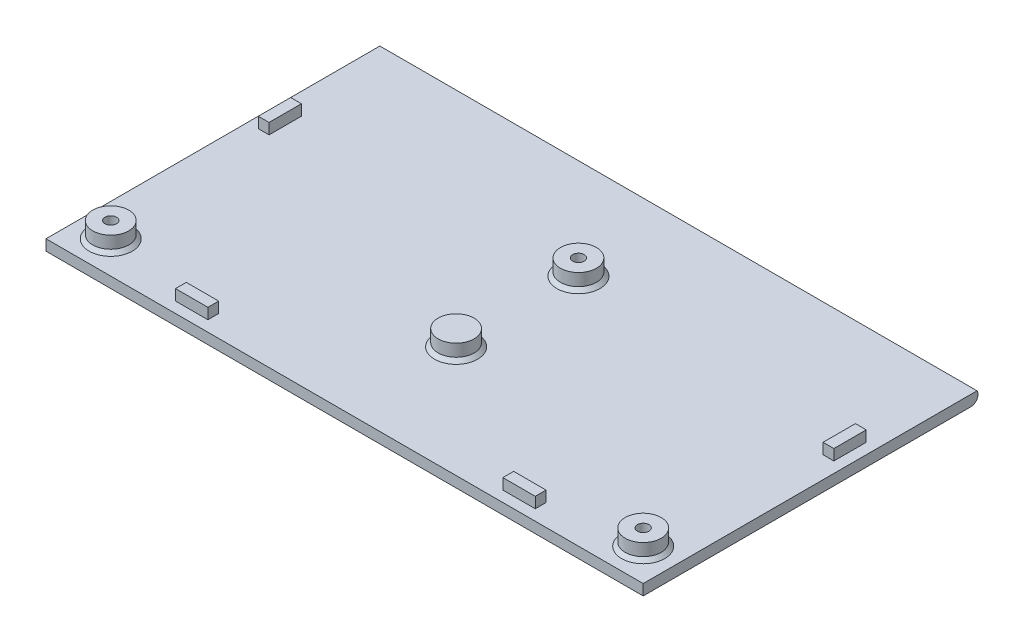
ISO-10303-21;
HEADER;
FILE_DESCRIPTION(('STEP AP214'),'2;1');
FILE_NAME('part.step','',(''),(''),'','','');
FILE_SCHEMA(('AUTOMOTIVE_DESIGN { 1 0 10303 214 1 1 1 1 }'));
ENDSEC;
DATA;
#1=APPLICATION_CONTEXT('core data for automotive mechanical design processes');
#2=APPLICATION_PROTOCOL_DEFINITION('international standard','automotive_design',2000,#1);
#3=PRODUCT_CONTEXT('',#1,'mechanical');
#4=PRODUCT('Part','Part','',(#3));
#5=PRODUCT_RELATED_PRODUCT_CATEGORY('part','',(#4));
#6=PRODUCT_DEFINITION_FORMATION('','',#4);
#7=PRODUCT_DEFINITION_CONTEXT('part definition',#1,'design');
#8=PRODUCT_DEFINITION('design','',#6,#7);
#9=PRODUCT_DEFINITION_SHAPE('','',#8);
#10=(LENGTH_UNIT() NAMED_UNIT(*) SI_UNIT(.MILLI.,.METRE.));
#11=(NAMED_UNIT(*) PLANE_ANGLE_UNIT() SI_UNIT($,.RADIAN.));
#12=(NAMED_UNIT(*) SI_UNIT($,.STERADIAN.) SOLID_ANGLE_UNIT());
#13=UNCERTAINTY_MEASURE_WITH_UNIT(LENGTH_MEASURE(1.E-05),#10,'distance_accuracy_value','');
#14=(GEOMETRIC_REPRESENTATION_CONTEXT(3) GLOBAL_UNCERTAINTY_ASSIGNED_CONTEXT((#13)) GLOBAL_UNIT_ASSIGNED_CONTEXT((#10,
#11,#12)) REPRESENTATION_CONTEXT('',''));
#15=CARTESIAN_POINT('',(0.,0.,0.));
#16=DIRECTION('',(0.,0.,1.));
#17=DIRECTION('',(1.,0.,0.));
#18=AXIS2_PLACEMENT_3D('',#15,#16,#17);
#19=CARTESIAN_POINT('',(83.,3.00000000000001,-92.8));
#20=DIRECTION('',(0.,-1.,0.));
#21=DIRECTION('',(0.,0.,-1.));
#22=AXIS2_PLACEMENT_3D('',#19,#20,#21);
#23=PLANE('',#22);
#24=CARTESIAN_POINT('',(0.,3.,-31.));
#25=DIRECTION('',(0.,-1.,0.));
#26=DIRECTION('',(0.,0.,-1.));
#27=AXIS2_PLACEMENT_3D('',#24,#25,#26);
#28=CIRCLE('',#27,6.00000000000001);
#29=CARTESIAN_POINT('',(0.,3.,-37.));
#30=VERTEX_POINT('',#29);
#31=EDGE_CURVE('E376',#30,#30,#28,.T.);
#32=ORIENTED_EDGE('',*,*,#31,.T.);
#33=EDGE_LOOP('',(#32));
#34=FACE_BOUND('',#33,.T.);
#35=CARTESIAN_POINT('',(0.,3.00000000000001,-65.));
#36=DIRECTION('',(0.,-1.,0.));
#37=DIRECTION('',(0.,0.,-1.));
#38=AXIS2_PLACEMENT_3D('',#35,#36,#37);
#39=CIRCLE('',#38,6.00000000000003);
#40=CARTESIAN_POINT('',(0.,3.00000000000001,-71.));
#41=VERTEX_POINT('',#40);
#42=EDGE_CURVE('E373',#41,#41,#39,.T.);
#43=ORIENTED_EDGE('',*,*,#42,.T.);
#44=EDGE_LOOP('',(#43));
#45=FACE_BOUND('',#44,.T.);
#46=CARTESIAN_POINT('',(-74.,3.,-9.));
#47=DIRECTION('',(0.,-1.,0.));
#48=DIRECTION('',(0.,0.,-1.));
#49=AXIS2_PLACEMENT_3D('',#46,#47,#48);
#50=CIRCLE('',#49,6.);
#51=CARTESIAN_POINT('',(-74.,3.,-15.));
#52=VERTEX_POINT('',#51);
#53=EDGE_CURVE('E370',#52,#52,#50,.T.);
#54=ORIENTED_EDGE('',*,*,#53,.T.);
#55=EDGE_LOOP('',(#54));
#56=FACE_BOUND('',#55,.T.);
#57=CARTESIAN_POINT('',(74.,3.,-9.));
#58=DIRECTION('',(0.,-1.,0.));
#59=DIRECTION('',(0.,0.,-1.));
#60=AXIS2_PLACEMENT_3D('',#57,#58,#59);
#61=CIRCLE('',#60,6.);
#62=CARTESIAN_POINT('',(74.,3.,-15.));
#63=VERTEX_POINT('',#62);
#64=EDGE_CURVE('E367',#63,#63,#61,.T.);
#65=ORIENTED_EDGE('',*,*,#64,.T.);
#66=EDGE_LOOP('',(#65));
#67=FACE_BOUND('',#66,.T.);
#68=DIRECTION('',(-1.,0.,0.));
#69=VECTOR('',#68,1.);
#70=CARTESIAN_POINT('',(83.,3.,-6.00000000000001));
#71=LINE('',#70,#69);
#72=CARTESIAN_POINT('',(50.,3.,-6.00000000000001));
#73=VERTEX_POINT('',#72);
#74=CARTESIAN_POINT('',(41.,3.,-6.00000000000001));
#75=VERTEX_POINT('',#74);
#76=EDGE_CURVE('E201',#73,#75,#71,.T.);
#77=ORIENTED_EDGE('',*,*,#76,.F.);
#78=DIRECTION('',(0.,0.,-1.));
#79=VECTOR('',#78,1.);
#80=CARTESIAN_POINT('',(50.,3.00000000000001,-92.8));
#81=LINE('',#80,#79);
#82=CARTESIAN_POINT('',(50.,3.,-3.));
#83=VERTEX_POINT('',#82);
#84=EDGE_CURVE('E214',#83,#73,#81,.T.);
#85=ORIENTED_EDGE('',*,*,#84,.F.);
#86=DIRECTION('',(1.,0.,0.));
#87=VECTOR('',#86,1.);
#88=CARTESIAN_POINT('',(83.,3.,-3.));
#89=LINE('',#88,#87);
#90=CARTESIAN_POINT('',(41.,3.,-3.));
#91=VERTEX_POINT('',#90);
#92=EDGE_CURVE('E223',#91,#83,#89,.T.);
#93=ORIENTED_EDGE('',*,*,#92,.F.);
#94=DIRECTION('',(0.,0.,1.));
#95=VECTOR('',#94,1.);
#96=CARTESIAN_POINT('',(41.,3.00000000000001,-92.8));
#97=LINE('',#96,#95);
#98=EDGE_CURVE('E204',#75,#91,#97,.T.);
#99=ORIENTED_EDGE('',*,*,#98,.F.);
#100=EDGE_LOOP('',(#77,#85,#93,#99));
#101=FACE_BOUND('',#100,.T.);
#102=DIRECTION('',(0.,0.,-1.));
#103=VECTOR('',#102,1.);
#104=CARTESIAN_POINT('',(80.,3.00000000000001,-92.8));
#105=LINE('',#104,#103);
#106=CARTESIAN_POINT('',(80.,3.00000000000001,-56.));
#107=VERTEX_POINT('',#106);
#108=CARTESIAN_POINT('',(80.,3.00000000000001,-65.));
#109=VERTEX_POINT('',#108);
#110=EDGE_CURVE('E272',#107,#109,#105,.T.);
#111=ORIENTED_EDGE('',*,*,#110,.F.);
#112=DIRECTION('',(1.,0.,0.));
#113=VECTOR('',#112,1.);
#114=CARTESIAN_POINT('',(83.,3.00000000000001,-56.));
#115=LINE('',#114,#113);
#116=CARTESIAN_POINT('',(77.,3.00000000000001,-56.));
#117=VERTEX_POINT('',#116);
#118=EDGE_CURVE('E277',#117,#107,#115,.T.);
#119=ORIENTED_EDGE('',*,*,#118,.F.);
#120=DIRECTION('',(0.,0.,1.));
#121=VECTOR('',#120,1.);
#122=CARTESIAN_POINT('',(77.,3.00000000000001,-92.8));
#123=LINE('',#122,#121);
#124=CARTESIAN_POINT('',(77.,3.00000000000001,-65.));
#125=VERTEX_POINT('',#124);
#126=EDGE_CURVE('E289',#125,#117,#123,.T.);
#127=ORIENTED_EDGE('',*,*,#126,.F.);
#128=DIRECTION('',(-1.,0.,0.));
#129=VECTOR('',#128,1.);
#130=CARTESIAN_POINT('',(83.,3.00000000000001,-65.));
#131=LINE('',#130,#129);
#132=EDGE_CURVE('E286',#109,#125,#131,.T.);
#133=ORIENTED_EDGE('',*,*,#132,.F.);
#134=EDGE_LOOP('',(#111,#119,#127,#133));
#135=FACE_BOUND('',#134,.T.);
#136=DIRECTION('',(0.,0.,1.));
#137=VECTOR('',#136,1.);
#138=CARTESIAN_POINT('',(-83.,3.00000000000001,-92.8));
#139=LINE('',#138,#137);
#140=CARTESIAN_POINT('',(-83.,3.00000000000001,-92.8));
#141=VERTEX_POINT('',#140);
#142=CARTESIAN_POINT('',(-83.,3.,0.));
#143=VERTEX_POINT('',#142);
#144=EDGE_CURVE('E326',#141,#143,#139,.T.);
#145=ORIENTED_EDGE('',*,*,#144,.T.);
#146=DIRECTION('',(-1.,0.,0.));
#147=VECTOR('',#146,1.);
#148=CARTESIAN_POINT('',(83.,3.,0.));
#149=LINE('',#148,#147);
#150=CARTESIAN_POINT('',(83.,3.,0.));
#151=VERTEX_POINT('',#150);
#152=EDGE_CURVE('E346',#151,#143,#149,.T.);
#153=ORIENTED_EDGE('',*,*,#152,.F.);
#154=DIRECTION('',(0.,0.,1.));
#155=VECTOR('',#154,1.);
#156=CARTESIAN_POINT('',(83.,3.00000000000001,-92.8));
#157=LINE('',#156,#155);
#158=CARTESIAN_POINT('',(83.,3.00000000000001,-92.8));
#159=VERTEX_POINT('',#158);
#160=EDGE_CURVE('E327',#159,#151,#157,.T.);
#161=ORIENTED_EDGE('',*,*,#160,.F.);
#162=DIRECTION('',(-1.,0.,0.));
#163=VECTOR('',#162,1.);
#164=CARTESIAN_POINT('',(83.,3.00000000000001,-92.8));
#165=LINE('',#164,#163);
#166=EDGE_CURVE('E335',#159,#141,#165,.T.);
#167=ORIENTED_EDGE('',*,*,#166,.T.);
#168=EDGE_LOOP('',(#145,#153,#161,#167));
#169=FACE_BOUND('',#168,.T.);
#170=DIRECTION('',(0.,0.,1.));
#171=VECTOR('',#170,1.);
#172=CARTESIAN_POINT('',(-80.,3.00000000000001,-92.8));
#173=LINE('',#172,#171);
#174=CARTESIAN_POINT('',(-80.,3.00000000000001,-65.));
#175=VERTEX_POINT('',#174);
#176=CARTESIAN_POINT('',(-80.,3.00000000000001,-56.));
#177=VERTEX_POINT('',#176);
#178=EDGE_CURVE('E239',#175,#177,#173,.T.);
#179=ORIENTED_EDGE('',*,*,#178,.F.);
#180=DIRECTION('',(-1.,0.,0.));
#181=VECTOR('',#180,1.);
#182=CARTESIAN_POINT('',(83.,3.00000000000001,-65.));
#183=LINE('',#182,#181);
#184=CARTESIAN_POINT('',(-77.,3.00000000000001,-65.));
#185=VERTEX_POINT('',#184);
#186=EDGE_CURVE('E244',#185,#175,#183,.T.);
#187=ORIENTED_EDGE('',*,*,#186,.F.);
#188=DIRECTION('',(0.,0.,-1.));
#189=VECTOR('',#188,1.);
#190=CARTESIAN_POINT('',(-77.,3.00000000000001,-92.8));
#191=LINE('',#190,#189);
#192=CARTESIAN_POINT('',(-77.,3.00000000000001,-56.));
#193=VERTEX_POINT('',#192);
#194=EDGE_CURVE('E256',#193,#185,#191,.T.);
#195=ORIENTED_EDGE('',*,*,#194,.F.);
#196=DIRECTION('',(1.,0.,0.));
#197=VECTOR('',#196,1.);
#198=CARTESIAN_POINT('',(83.,3.00000000000001,-56.));
#199=LINE('',#198,#197);
#200=EDGE_CURVE('E253',#177,#193,#199,.T.);
#201=ORIENTED_EDGE('',*,*,#200,.F.);
#202=EDGE_LOOP('',(#179,#187,#195,#201));
#203=FACE_BOUND('',#202,.T.);
#204=DIRECTION('',(-1.,0.,0.));
#205=VECTOR('',#204,1.);
#206=CARTESIAN_POINT('',(83.,3.,-6.00000000000001));
#207=LINE('',#206,#205);
#208=CARTESIAN_POINT('',(-41.,3.,-6.00000000000001));
#209=VERTEX_POINT('',#208);
#210=CARTESIAN_POINT('',(-50.,3.,-6.00000000000001));
#211=VERTEX_POINT('',#210);
#212=EDGE_CURVE('E200',#209,#211,#207,.T.);
#213=ORIENTED_EDGE('',*,*,#212,.F.);
#214=DIRECTION('',(0.,0.,-1.));
#215=VECTOR('',#214,1.);
#216=CARTESIAN_POINT('',(-41.,3.00000000000001,-92.8));
#217=LINE('',#216,#215);
#218=CARTESIAN_POINT('',(-41.,3.,-3.));
#219=VERTEX_POINT('',#218);
#220=EDGE_CURVE('E197',#219,#209,#217,.T.);
#221=ORIENTED_EDGE('',*,*,#220,.F.);
#222=DIRECTION('',(1.,0.,0.));
#223=VECTOR('',#222,1.);
#224=CARTESIAN_POINT('',(83.,3.,-3.));
#225=LINE('',#224,#223);
#226=CARTESIAN_POINT('',(-50.,3.,-3.));
#227=VERTEX_POINT('',#226);
#228=EDGE_CURVE('E421',#227,#219,#225,.T.);
#229=ORIENTED_EDGE('',*,*,#228,.F.);
#230=DIRECTION('',(0.,0.,1.));
#231=VECTOR('',#230,1.);
#232=CARTESIAN_POINT('',(-50.,3.00000000000001,-92.8));
#233=LINE('',#232,#231);
#234=EDGE_CURVE('E414',#211,#227,#233,.T.);
#235=ORIENTED_EDGE('',*,*,#234,.F.);
#236=EDGE_LOOP('',(#213,#221,#229,#235));
#237=FACE_BOUND('',#236,.T.);
#238=ADVANCED_FACE('F39',(#34,#45,#56,#67,#101,#135,#169,#203,#237),#23,.F.);
#239=CARTESIAN_POINT('',(83.,3.,0.));
#240=DIRECTION('',(0.,0.,-1.));
#241=DIRECTION('',(0.,1.,0.));
#242=AXIS2_PLACEMENT_3D('',#239,#240,#241);
#243=PLANE('',#242);
#244=DIRECTION('',(0.,-1.,0.));
#245=VECTOR('',#244,1.);
#246=CARTESIAN_POINT('',(-83.,3.,0.));
#247=LINE('',#246,#245);
#248=CARTESIAN_POINT('',(-83.,0.,0.));
#249=VERTEX_POINT('',#248);
#250=EDGE_CURVE('E338',#143,#249,#247,.T.);
#251=ORIENTED_EDGE('',*,*,#250,.T.);
#252=DIRECTION('',(-1.,0.,0.));
#253=VECTOR('',#252,1.);
#254=CARTESIAN_POINT('',(83.,0.,0.));
#255=LINE('',#254,#253);
#256=CARTESIAN_POINT('',(83.,0.,0.));
#257=VERTEX_POINT('',#256);
#258=EDGE_CURVE('E343',#257,#249,#255,.T.);
#259=ORIENTED_EDGE('',*,*,#258,.F.);
#260=DIRECTION('',(0.,-1.,0.));
#261=VECTOR('',#260,1.);
#262=CARTESIAN_POINT('',(83.,3.,0.));
#263=LINE('',#262,#261);
#264=EDGE_CURVE('E330',#151,#257,#263,.T.);
#265=ORIENTED_EDGE('',*,*,#264,.F.);
#266=ORIENTED_EDGE('',*,*,#152,.T.);
#267=EDGE_LOOP('',(#251,#259,#265,#266));
#268=FACE_BOUND('',#267,.T.);
#269=ADVANCED_FACE('F404',(#268),#243,.F.);
#270=CARTESIAN_POINT('',(83.,0.,0.));
#271=DIRECTION('',(0.,1.,0.));
#272=DIRECTION('',(0.,0.,1.));
#273=AXIS2_PLACEMENT_3D('',#270,#271,#272);
#274=PLANE('',#273);
#275=CARTESIAN_POINT('',(0.,0.,-65.));
#276=DIRECTION('',(0.,1.,0.));
#277=DIRECTION('',(0.,0.,1.));
#278=AXIS2_PLACEMENT_3D('',#275,#276,#277);
#279=CIRCLE('',#278,3.59999999999999);
#280=CARTESIAN_POINT('',(0.,0.,-61.4));
#281=VERTEX_POINT('',#280);
#282=EDGE_CURVE('E355',#281,#281,#279,.T.);
#283=ORIENTED_EDGE('',*,*,#282,.T.);
#284=EDGE_LOOP('',(#283));
#285=FACE_BOUND('',#284,.T.);
#286=CARTESIAN_POINT('',(74.,0.,-9.));
#287=DIRECTION('',(0.,1.,0.));
#288=DIRECTION('',(0.,0.,1.));
#289=AXIS2_PLACEMENT_3D('',#286,#287,#288);
#290=CIRCLE('',#289,3.60000000000002);
#291=CARTESIAN_POINT('',(74.,0.,-5.39999999999998));
#292=VERTEX_POINT('',#291);
#293=EDGE_CURVE('E352',#292,#292,#290,.T.);
#294=ORIENTED_EDGE('',*,*,#293,.T.);
#295=EDGE_LOOP('',(#294));
#296=FACE_BOUND('',#295,.T.);
#297=CARTESIAN_POINT('',(-74.,0.,-9.));
#298=DIRECTION('',(0.,1.,0.));
#299=DIRECTION('',(0.,0.,1.));
#300=AXIS2_PLACEMENT_3D('',#297,#298,#299);
#301=CIRCLE('',#300,3.60000000000002);
#302=CARTESIAN_POINT('',(-74.,0.,-5.39999999999998));
#303=VERTEX_POINT('',#302);
#304=EDGE_CURVE('E349',#303,#303,#301,.T.);
#305=ORIENTED_EDGE('',*,*,#304,.T.);
#306=EDGE_LOOP('',(#305));
#307=FACE_BOUND('',#306,.T.);
#308=DIRECTION('',(0.,0.,-1.));
#309=VECTOR('',#308,1.);
#310=CARTESIAN_POINT('',(-83.,0.,0.));
#311=LINE('',#310,#309);
#312=CARTESIAN_POINT('',(-83.,0.,-91.0679491924311));
#313=VERTEX_POINT('',#312);
#314=EDGE_CURVE('E331',#249,#313,#311,.T.);
#315=ORIENTED_EDGE('',*,*,#314,.T.);
#316=DIRECTION('',(1.,0.,0.));
#317=VECTOR('',#316,1.);
#318=CARTESIAN_POINT('',(83.,0.,-91.0679491924311));
#319=LINE('',#318,#317);
#320=CARTESIAN_POINT('',(83.,0.,-91.0679491924311));
#321=VERTEX_POINT('',#320);
#322=EDGE_CURVE('E47',#313,#321,#319,.T.);
#323=ORIENTED_EDGE('',*,*,#322,.T.);
#324=DIRECTION('',(0.,0.,-1.));
#325=VECTOR('',#324,1.);
#326=CARTESIAN_POINT('',(83.,0.,0.));
#327=LINE('',#326,#325);
#328=EDGE_CURVE('E333',#257,#321,#327,.T.);
#329=ORIENTED_EDGE('',*,*,#328,.F.);
#330=ORIENTED_EDGE('',*,*,#258,.T.);
#331=EDGE_LOOP('',(#315,#323,#329,#330));
#332=FACE_BOUND('',#331,.T.);
#333=ADVANCED_FACE('F550',(#285,#296,#307,#332),#274,.F.);
#334=CARTESIAN_POINT('',(83.,0.,0.));
#335=DIRECTION('',(1.,0.,0.));
#336=DIRECTION('',(0.,0.,-1.));
#337=AXIS2_PLACEMENT_3D('',#334,#335,#336);
#338=PLANE('',#337);
#339=ORIENTED_EDGE('',*,*,#328,.T.);
#340=CARTESIAN_POINT('',(83.,2.,-91.0679491924311));
#341=DIRECTION('',(1.,0.,0.));
#342=DIRECTION('',(0.,0.,-1.));
#343=AXIS2_PLACEMENT_3D('',#340,#341,#342);
#344=CIRCLE('',#343,2.);
#345=EDGE_CURVE('E11',#321,#159,#344,.T.);
#346=ORIENTED_EDGE('',*,*,#345,.T.);
#347=ORIENTED_EDGE('',*,*,#160,.T.);
#348=ORIENTED_EDGE('',*,*,#264,.T.);
#349=EDGE_LOOP('',(#339,#346,#347,#348));
#350=FACE_BOUND('',#349,.T.);
#351=ADVANCED_FACE('F547',(#350),#338,.T.);
#352=CARTESIAN_POINT('',(-83.,0.,0.));
#353=DIRECTION('',(1.,0.,0.));
#354=DIRECTION('',(0.,0.,-1.));
#355=AXIS2_PLACEMENT_3D('',#352,#353,#354);
#356=PLANE('',#355);
#357=ORIENTED_EDGE('',*,*,#144,.F.);
#358=CARTESIAN_POINT('',(-83.,2.,-91.0679491924311));
#359=DIRECTION('',(1.,0.,0.));
#360=DIRECTION('',(0.,0.,-1.));
#361=AXIS2_PLACEMENT_3D('',#358,#359,#360);
#362=CIRCLE('',#361,2.);
#363=EDGE_CURVE('E61',#141,#313,#362,.F.);
#364=ORIENTED_EDGE('',*,*,#363,.T.);
#365=ORIENTED_EDGE('',*,*,#314,.F.);
#366=ORIENTED_EDGE('',*,*,#250,.F.);
#367=EDGE_LOOP('',(#357,#364,#365,#366));
#368=FACE_BOUND('',#367,.T.);
#369=ADVANCED_FACE('F545',(#368),#356,.F.);
#370=CARTESIAN_POINT('',(-74.,7.4,-9.));
#371=DIRECTION('',(0.,-1.,0.));
#372=DIRECTION('',(0.,0.,-1.));
#373=AXIS2_PLACEMENT_3D('',#370,#371,#372);
#374=CYLINDRICAL_SURFACE('',#373,5.);
#375=CARTESIAN_POINT('',(-74.,4.,-9.));
#376=DIRECTION('',(0.,-1.,0.));
#377=DIRECTION('',(0.,0.,-1.));
#378=AXIS2_PLACEMENT_3D('',#375,#376,#377);
#379=CIRCLE('',#378,5.);
#380=CARTESIAN_POINT('',(-74.,4.,-14.));
#381=VERTEX_POINT('',#380);
#382=EDGE_CURVE('E385',#381,#381,#379,.F.);
#383=ORIENTED_EDGE('',*,*,#382,.T.);
#384=EDGE_LOOP('',(#383));
#385=FACE_BOUND('',#384,.T.);
#386=CARTESIAN_POINT('',(-74.,7.4,-9.));
#387=DIRECTION('',(0.,-1.,0.));
#388=DIRECTION('',(0.,0.,-1.));
#389=AXIS2_PLACEMENT_3D('',#386,#387,#388);
#390=CIRCLE('',#389,5.);
#391=CARTESIAN_POINT('',(-74.,7.4,-14.));
#392=VERTEX_POINT('',#391);
#393=EDGE_CURVE('E323',#392,#392,#390,.T.);
#394=ORIENTED_EDGE('',*,*,#393,.T.);
#395=EDGE_LOOP('',(#394));
#396=FACE_BOUND('',#395,.T.);
#397=ADVANCED_FACE('F541',(#385,#396),#374,.T.);
#398=CARTESIAN_POINT('',(-74.,7.4,-9.));
#399=DIRECTION('',(0.,-1.,0.));
#400=DIRECTION('',(0.,0.,-1.));
#401=AXIS2_PLACEMENT_3D('',#398,#399,#400);
#402=PLANE('',#401);
#403=CARTESIAN_POINT('',(-74.,7.4,-9.));
#404=DIRECTION('',(0.,-1.,0.));
#405=DIRECTION('',(0.,0.,-1.));
#406=AXIS2_PLACEMENT_3D('',#403,#404,#405);
#407=CIRCLE('',#406,1.6);
#408=CARTESIAN_POINT('',(-74.,7.4,-10.6));
#409=VERTEX_POINT('',#408);
#410=EDGE_CURVE('E310',#409,#409,#407,.T.);
#411=ORIENTED_EDGE('',*,*,#410,.T.);
#412=EDGE_LOOP('',(#411));
#413=FACE_BOUND('',#412,.T.);
#414=ORIENTED_EDGE('',*,*,#393,.F.);
#415=EDGE_LOOP('',(#414));
#416=FACE_BOUND('',#415,.T.);
#417=ADVANCED_FACE('F538',(#413,#416),#402,.F.);
#418=CARTESIAN_POINT('',(74.,7.4,-9.));
#419=DIRECTION('',(0.,-1.,0.));
#420=DIRECTION('',(0.,0.,-1.));
#421=AXIS2_PLACEMENT_3D('',#418,#419,#420);
#422=CYLINDRICAL_SURFACE('',#421,5.);
#423=CARTESIAN_POINT('',(74.,4.,-9.));
#424=DIRECTION('',(0.,-1.,0.));
#425=DIRECTION('',(0.,0.,-1.));
#426=AXIS2_PLACEMENT_3D('',#423,#424,#425);
#427=CIRCLE('',#426,5.);
#428=CARTESIAN_POINT('',(74.,4.,-14.));
#429=VERTEX_POINT('',#428);
#430=EDGE_CURVE('E388',#429,#429,#427,.F.);
#431=ORIENTED_EDGE('',*,*,#430,.T.);
#432=EDGE_LOOP('',(#431));
#433=FACE_BOUND('',#432,.T.);
#434=CARTESIAN_POINT('',(74.,7.4,-9.));
#435=DIRECTION('',(0.,-1.,0.));
#436=DIRECTION('',(0.,0.,-1.));
#437=AXIS2_PLACEMENT_3D('',#434,#435,#436);
#438=CIRCLE('',#437,5.);
#439=CARTESIAN_POINT('',(74.,7.4,-14.));
#440=VERTEX_POINT('',#439);
#441=EDGE_CURVE('E320',#440,#440,#438,.T.);
#442=ORIENTED_EDGE('',*,*,#441,.T.);
#443=EDGE_LOOP('',(#442));
#444=FACE_BOUND('',#443,.T.);
#445=ADVANCED_FACE('F393',(#433,#444),#422,.T.);
#446=CARTESIAN_POINT('',(74.,7.4,-9.));
#447=DIRECTION('',(0.,-1.,0.));
#448=DIRECTION('',(0.,0.,-1.));
#449=AXIS2_PLACEMENT_3D('',#446,#447,#448);
#450=PLANE('',#449);
#451=CARTESIAN_POINT('',(74.,7.4,-9.));
#452=DIRECTION('',(0.,-1.,0.));
#453=DIRECTION('',(0.,0.,-1.));
#454=AXIS2_PLACEMENT_3D('',#451,#452,#453);
#455=CIRCLE('',#454,1.6);
#456=CARTESIAN_POINT('',(74.,7.4,-10.6));
#457=VERTEX_POINT('',#456);
#458=EDGE_CURVE('E306',#457,#457,#455,.T.);
#459=ORIENTED_EDGE('',*,*,#458,.T.);
#460=EDGE_LOOP('',(#459));
#461=FACE_BOUND('',#460,.T.);
#462=ORIENTED_EDGE('',*,*,#441,.F.);
#463=EDGE_LOOP('',(#462));
#464=FACE_BOUND('',#463,.T.);
#465=ADVANCED_FACE('F531',(#461,#464),#450,.F.);
#466=CARTESIAN_POINT('',(0.,7.40000000000001,-65.));
#467=DIRECTION('',(0.,-1.,0.));
#468=DIRECTION('',(0.,0.,-1.));
#469=AXIS2_PLACEMENT_3D('',#466,#467,#468);
#470=CYLINDRICAL_SURFACE('',#469,5.);
#471=CARTESIAN_POINT('',(0.,4.00000000000006,-65.));
#472=DIRECTION('',(0.,-1.,0.));
#473=DIRECTION('',(0.,0.,-1.));
#474=AXIS2_PLACEMENT_3D('',#471,#472,#473);
#475=CIRCLE('',#474,5.);
#476=CARTESIAN_POINT('',(0.,4.00000000000006,-70.));
#477=VERTEX_POINT('',#476);
#478=EDGE_CURVE('E382',#477,#477,#475,.F.);
#479=ORIENTED_EDGE('',*,*,#478,.T.);
#480=EDGE_LOOP('',(#479));
#481=FACE_BOUND('',#480,.T.);
#482=CARTESIAN_POINT('',(0.,7.40000000000001,-65.));
#483=DIRECTION('',(0.,-1.,0.));
#484=DIRECTION('',(0.,0.,-1.));
#485=AXIS2_PLACEMENT_3D('',#482,#483,#484);
#486=CIRCLE('',#485,5.);
#487=CARTESIAN_POINT('',(0.,7.40000000000001,-70.));
#488=VERTEX_POINT('',#487);
#489=EDGE_CURVE('E317',#488,#488,#486,.T.);
#490=ORIENTED_EDGE('',*,*,#489,.T.);
#491=EDGE_LOOP('',(#490));
#492=FACE_BOUND('',#491,.T.);
#493=ADVANCED_FACE('F527',(#481,#492),#470,.T.);
#494=CARTESIAN_POINT('',(0.,7.40000000000001,-65.));
#495=DIRECTION('',(0.,-1.,0.));
#496=DIRECTION('',(0.,0.,-1.));
#497=AXIS2_PLACEMENT_3D('',#494,#495,#496);
#498=PLANE('',#497);
#499=CARTESIAN_POINT('',(0.,7.40000000000001,-65.));
#500=DIRECTION('',(0.,-1.,0.));
#501=DIRECTION('',(0.,0.,-1.));
#502=AXIS2_PLACEMENT_3D('',#499,#500,#501);
#503=CIRCLE('',#502,1.6);
#504=CARTESIAN_POINT('',(0.,7.40000000000001,-66.6));
#505=VERTEX_POINT('',#504);
#506=EDGE_CURVE('E305',#505,#505,#503,.T.);
#507=ORIENTED_EDGE('',*,*,#506,.T.);
#508=EDGE_LOOP('',(#507));
#509=FACE_BOUND('',#508,.T.);
#510=ORIENTED_EDGE('',*,*,#489,.F.);
#511=EDGE_LOOP('',(#510));
#512=FACE_BOUND('',#511,.T.);
#513=ADVANCED_FACE('F523',(#509,#512),#498,.F.);
#514=CARTESIAN_POINT('',(0.,7.4,-31.));
#515=DIRECTION('',(0.,-1.,0.));
#516=DIRECTION('',(0.,0.,-1.));
#517=AXIS2_PLACEMENT_3D('',#514,#515,#516);
#518=CYLINDRICAL_SURFACE('',#517,5.);
#519=CARTESIAN_POINT('',(0.,3.99999999999998,-31.));
#520=DIRECTION('',(0.,-1.,0.));
#521=DIRECTION('',(0.,0.,-1.));
#522=AXIS2_PLACEMENT_3D('',#519,#520,#521);
#523=CIRCLE('',#522,5.);
#524=CARTESIAN_POINT('',(0.,3.99999999999998,-36.));
#525=VERTEX_POINT('',#524);
#526=EDGE_CURVE('E379',#525,#525,#523,.F.);
#527=ORIENTED_EDGE('',*,*,#526,.T.);
#528=EDGE_LOOP('',(#527));
#529=FACE_BOUND('',#528,.T.);
#530=CARTESIAN_POINT('',(0.,7.4,-31.));
#531=DIRECTION('',(0.,-1.,0.));
#532=DIRECTION('',(0.,0.,-1.));
#533=AXIS2_PLACEMENT_3D('',#530,#531,#532);
#534=CIRCLE('',#533,5.);
#535=CARTESIAN_POINT('',(0.,7.4,-36.));
#536=VERTEX_POINT('',#535);
#537=EDGE_CURVE('E309',#536,#536,#534,.T.);
#538=ORIENTED_EDGE('',*,*,#537,.T.);
#539=EDGE_LOOP('',(#538));
#540=FACE_BOUND('',#539,.T.);
#541=ADVANCED_FACE('F519',(#529,#540),#518,.T.);
#542=CARTESIAN_POINT('',(0.,7.4,-31.));
#543=DIRECTION('',(0.,-1.,0.));
#544=DIRECTION('',(0.,0.,-1.));
#545=AXIS2_PLACEMENT_3D('',#542,#543,#544);
#546=PLANE('',#545);
#547=ORIENTED_EDGE('',*,*,#537,.F.);
#548=EDGE_LOOP('',(#547));
#549=FACE_BOUND('',#548,.T.);
#550=ADVANCED_FACE('F515',(#549),#546,.F.);
#551=CARTESIAN_POINT('',(0.,7.40100000000001,-65.));
#552=DIRECTION('',(0.,-1.,0.));
#553=DIRECTION('',(0.,0.,-1.));
#554=AXIS2_PLACEMENT_3D('',#551,#552,#553);
#555=CYLINDRICAL_SURFACE('',#554,1.6);
#556=CARTESIAN_POINT('',(0.,2.00000000000003,-65.));
#557=DIRECTION('',(0.,1.,0.));
#558=DIRECTION('',(0.,0.,1.));
#559=AXIS2_PLACEMENT_3D('',#556,#557,#558);
#560=CIRCLE('',#559,1.6);
#561=CARTESIAN_POINT('',(0.,2.00000000000003,-63.4));
#562=VERTEX_POINT('',#561);
#563=EDGE_CURVE('E358',#562,#562,#560,.F.);
#564=ORIENTED_EDGE('',*,*,#563,.T.);
#565=EDGE_LOOP('',(#564));
#566=FACE_BOUND('',#565,.T.);
#567=ORIENTED_EDGE('',*,*,#506,.F.);
#568=EDGE_LOOP('',(#567));
#569=FACE_BOUND('',#568,.T.);
#570=ADVANCED_FACE('F507',(#566,#569),#555,.F.);
#571=CARTESIAN_POINT('',(74.,7.40100000000001,-9.));
#572=DIRECTION('',(0.,-1.,0.));
#573=DIRECTION('',(0.,0.,-1.));
#574=AXIS2_PLACEMENT_3D('',#571,#572,#573);
#575=CYLINDRICAL_SURFACE('',#574,1.6);
#576=CARTESIAN_POINT('',(74.,2.00000000000001,-9.));
#577=DIRECTION('',(0.,1.,0.));
#578=DIRECTION('',(0.,0.,1.));
#579=AXIS2_PLACEMENT_3D('',#576,#577,#578);
#580=CIRCLE('',#579,1.6);
#581=CARTESIAN_POINT('',(74.,2.00000000000001,-7.4));
#582=VERTEX_POINT('',#581);
#583=EDGE_CURVE('E361',#582,#582,#580,.F.);
#584=ORIENTED_EDGE('',*,*,#583,.T.);
#585=EDGE_LOOP('',(#584));
#586=FACE_BOUND('',#585,.T.);
#587=ORIENTED_EDGE('',*,*,#458,.F.);
#588=EDGE_LOOP('',(#587));
#589=FACE_BOUND('',#588,.T.);
#590=ADVANCED_FACE('F503',(#586,#589),#575,.F.);
#591=CARTESIAN_POINT('',(-74.,7.40100000000001,-9.));
#592=DIRECTION('',(0.,-1.,0.));
#593=DIRECTION('',(0.,0.,-1.));
#594=AXIS2_PLACEMENT_3D('',#591,#592,#593);
#595=CYLINDRICAL_SURFACE('',#594,1.6);
#596=CARTESIAN_POINT('',(-74.,2.00000000000001,-9.));
#597=DIRECTION('',(0.,1.,0.));
#598=DIRECTION('',(0.,0.,1.));
#599=AXIS2_PLACEMENT_3D('',#596,#597,#598);
#600=CIRCLE('',#599,1.6);
#601=CARTESIAN_POINT('',(-74.,2.00000000000001,-7.39999999999999));
#602=VERTEX_POINT('',#601);
#603=EDGE_CURVE('E364',#602,#602,#600,.F.);
#604=ORIENTED_EDGE('',*,*,#603,.T.);
#605=EDGE_LOOP('',(#604));
#606=FACE_BOUND('',#605,.T.);
#607=ORIENTED_EDGE('',*,*,#410,.F.);
#608=EDGE_LOOP('',(#607));
#609=FACE_BOUND('',#608,.T.);
#610=ADVANCED_FACE('F506',(#606,#609),#595,.F.);
#611=CARTESIAN_POINT('',(0.,0.,-65.));
#612=DIRECTION('',(0.,-1.,0.));
#613=DIRECTION('',(0.,0.,-1.));
#614=AXIS2_PLACEMENT_3D('',#611,#612,#613);
#615=CONICAL_SURFACE('',#614,3.59999999999999,0.785398163397439);
#616=ORIENTED_EDGE('',*,*,#563,.F.);
#617=EDGE_LOOP('',(#616));
#618=FACE_BOUND('',#617,.T.);
#619=ORIENTED_EDGE('',*,*,#282,.F.);
#620=EDGE_LOOP('',(#619));
#621=FACE_BOUND('',#620,.T.);
#622=ADVANCED_FACE('F511',(#618,#621),#615,.F.);
#623=CARTESIAN_POINT('',(74.,0.,-9.));
#624=DIRECTION('',(0.,-1.,0.));
#625=DIRECTION('',(0.,0.,-1.));
#626=AXIS2_PLACEMENT_3D('',#623,#624,#625);
#627=CONICAL_SURFACE('',#626,3.60000000000002,0.78539816339745);
#628=ORIENTED_EDGE('',*,*,#583,.F.);
#629=EDGE_LOOP('',(#628));
#630=FACE_BOUND('',#629,.T.);
#631=ORIENTED_EDGE('',*,*,#293,.F.);
#632=EDGE_LOOP('',(#631));
#633=FACE_BOUND('',#632,.T.);
#634=ADVANCED_FACE('F566',(#630,#633),#627,.F.);
#635=CARTESIAN_POINT('',(-74.,0.,-9.));
#636=DIRECTION('',(0.,-1.,0.));
#637=DIRECTION('',(0.,0.,-1.));
#638=AXIS2_PLACEMENT_3D('',#635,#636,#637);
#639=CONICAL_SURFACE('',#638,3.60000000000002,0.78539816339745);
#640=ORIENTED_EDGE('',*,*,#603,.F.);
#641=EDGE_LOOP('',(#640));
#642=FACE_BOUND('',#641,.T.);
#643=ORIENTED_EDGE('',*,*,#304,.F.);
#644=EDGE_LOOP('',(#643));
#645=FACE_BOUND('',#644,.T.);
#646=ADVANCED_FACE('F501',(#642,#645),#639,.F.);
#647=CARTESIAN_POINT('',(80.,6.00000000000001,-92.8));
#648=DIRECTION('',(-1.,0.,0.));
#649=DIRECTION('',(0.,0.,1.));
#650=AXIS2_PLACEMENT_3D('',#647,#648,#649);
#651=PLANE('',#650);
#652=ORIENTED_EDGE('',*,*,#110,.T.);
#653=DIRECTION('',(0.,-1.,0.));
#654=VECTOR('',#653,1.);
#655=CARTESIAN_POINT('',(80.,6.00000000000001,-65.));
#656=LINE('',#655,#654);
#657=CARTESIAN_POINT('',(80.,6.00000000000001,-65.));
#658=VERTEX_POINT('',#657);
#659=EDGE_CURVE('E302',#658,#109,#656,.T.);
#660=ORIENTED_EDGE('',*,*,#659,.F.);
#661=DIRECTION('',(0.,0.,-1.));
#662=VECTOR('',#661,1.);
#663=CARTESIAN_POINT('',(80.,6.00000000000001,-92.8));
#664=LINE('',#663,#662);
#665=CARTESIAN_POINT('',(80.,6.00000000000001,-56.));
#666=VERTEX_POINT('',#665);
#667=EDGE_CURVE('E273',#666,#658,#664,.T.);
#668=ORIENTED_EDGE('',*,*,#667,.F.);
#669=DIRECTION('',(0.,-1.,0.));
#670=VECTOR('',#669,1.);
#671=CARTESIAN_POINT('',(80.,6.00000000000001,-56.));
#672=LINE('',#671,#670);
#673=EDGE_CURVE('E283',#666,#107,#672,.T.);
#674=ORIENTED_EDGE('',*,*,#673,.T.);
#675=EDGE_LOOP('',(#652,#660,#668,#674));
#676=FACE_BOUND('',#675,.T.);
#677=ADVANCED_FACE('F497',(#676),#651,.F.);
#678=CARTESIAN_POINT('',(83.,6.00000000000001,-65.));
#679=DIRECTION('',(0.,0.,1.));
#680=DIRECTION('',(1.,0.,0.));
#681=AXIS2_PLACEMENT_3D('',#678,#679,#680);
#682=PLANE('',#681);
#683=ORIENTED_EDGE('',*,*,#132,.T.);
#684=DIRECTION('',(0.,-1.,0.));
#685=VECTOR('',#684,1.);
#686=CARTESIAN_POINT('',(77.,6.00000000000001,-65.));
#687=LINE('',#686,#685);
#688=CARTESIAN_POINT('',(77.,6.00000000000001,-65.));
#689=VERTEX_POINT('',#688);
#690=EDGE_CURVE('E299',#689,#125,#687,.T.);
#691=ORIENTED_EDGE('',*,*,#690,.F.);
#692=DIRECTION('',(-1.,0.,0.));
#693=VECTOR('',#692,1.);
#694=CARTESIAN_POINT('',(83.,6.00000000000001,-65.));
#695=LINE('',#694,#693);
#696=EDGE_CURVE('E276',#658,#689,#695,.T.);
#697=ORIENTED_EDGE('',*,*,#696,.F.);
#698=ORIENTED_EDGE('',*,*,#659,.T.);
#699=EDGE_LOOP('',(#683,#691,#697,#698));
#700=FACE_BOUND('',#699,.T.);
#701=ADVANCED_FACE('F493',(#700),#682,.F.);
#702=CARTESIAN_POINT('',(77.,6.00000000000001,-92.8));
#703=DIRECTION('',(1.,0.,0.));
#704=DIRECTION('',(0.,0.,-1.));
#705=AXIS2_PLACEMENT_3D('',#702,#703,#704);
#706=PLANE('',#705);
#707=ORIENTED_EDGE('',*,*,#126,.T.);
#708=DIRECTION('',(0.,-1.,0.));
#709=VECTOR('',#708,1.);
#710=CARTESIAN_POINT('',(77.,6.00000000000001,-56.));
#711=LINE('',#710,#709);
#712=CARTESIAN_POINT('',(77.,6.00000000000001,-56.));
#713=VERTEX_POINT('',#712);
#714=EDGE_CURVE('E296',#713,#117,#711,.T.);
#715=ORIENTED_EDGE('',*,*,#714,.F.);
#716=DIRECTION('',(0.,0.,1.));
#717=VECTOR('',#716,1.);
#718=CARTESIAN_POINT('',(77.,6.00000000000001,-92.8));
#719=LINE('',#718,#717);
#720=EDGE_CURVE('E279',#689,#713,#719,.T.);
#721=ORIENTED_EDGE('',*,*,#720,.F.);
#722=ORIENTED_EDGE('',*,*,#690,.T.);
#723=EDGE_LOOP('',(#707,#715,#721,#722));
#724=FACE_BOUND('',#723,.T.);
#725=ADVANCED_FACE('F489',(#724),#706,.F.);
#726=CARTESIAN_POINT('',(83.,6.00000000000001,-56.));
#727=DIRECTION('',(0.,0.,-1.));
#728=DIRECTION('',(-1.,0.,0.));
#729=AXIS2_PLACEMENT_3D('',#726,#727,#728);
#730=PLANE('',#729);
#731=ORIENTED_EDGE('',*,*,#118,.T.);
#732=ORIENTED_EDGE('',*,*,#673,.F.);
#733=DIRECTION('',(1.,0.,0.));
#734=VECTOR('',#733,1.);
#735=CARTESIAN_POINT('',(83.,6.00000000000001,-56.));
#736=LINE('',#735,#734);
#737=EDGE_CURVE('E281',#713,#666,#736,.T.);
#738=ORIENTED_EDGE('',*,*,#737,.F.);
#739=ORIENTED_EDGE('',*,*,#714,.T.);
#740=EDGE_LOOP('',(#731,#732,#738,#739));
#741=FACE_BOUND('',#740,.T.);
#742=ADVANCED_FACE('F485',(#741),#730,.F.);
#743=CARTESIAN_POINT('',(0.,6.,0.));
#744=DIRECTION('',(0.,1.,0.));
#745=DIRECTION('',(0.,0.,1.));
#746=AXIS2_PLACEMENT_3D('',#743,#744,#745);
#747=PLANE('',#746);
#748=ORIENTED_EDGE('',*,*,#667,.T.);
#749=ORIENTED_EDGE('',*,*,#696,.T.);
#750=ORIENTED_EDGE('',*,*,#720,.T.);
#751=ORIENTED_EDGE('',*,*,#737,.T.);
#752=EDGE_LOOP('',(#748,#749,#750,#751));
#753=FACE_BOUND('',#752,.T.);
#754=ADVANCED_FACE('F481',(#753),#747,.T.);
#755=CARTESIAN_POINT('',(-80.,6.00000000000001,-92.8));
#756=DIRECTION('',(1.,0.,0.));
#757=DIRECTION('',(0.,0.,-1.));
#758=AXIS2_PLACEMENT_3D('',#755,#756,#757);
#759=PLANE('',#758);
#760=ORIENTED_EDGE('',*,*,#178,.T.);
#761=DIRECTION('',(0.,-1.,0.));
#762=VECTOR('',#761,1.);
#763=CARTESIAN_POINT('',(-80.,6.00000000000001,-56.));
#764=LINE('',#763,#762);
#765=CARTESIAN_POINT('',(-80.,6.00000000000001,-56.));
#766=VERTEX_POINT('',#765);
#767=EDGE_CURVE('E269',#766,#177,#764,.T.);
#768=ORIENTED_EDGE('',*,*,#767,.F.);
#769=DIRECTION('',(0.,0.,1.));
#770=VECTOR('',#769,1.);
#771=CARTESIAN_POINT('',(-80.,6.00000000000001,-92.8));
#772=LINE('',#771,#770);
#773=CARTESIAN_POINT('',(-80.,6.00000000000001,-65.));
#774=VERTEX_POINT('',#773);
#775=EDGE_CURVE('E240',#774,#766,#772,.T.);
#776=ORIENTED_EDGE('',*,*,#775,.F.);
#777=DIRECTION('',(0.,-1.,0.));
#778=VECTOR('',#777,1.);
#779=CARTESIAN_POINT('',(-80.,6.00000000000001,-65.));
#780=LINE('',#779,#778);
#781=EDGE_CURVE('E250',#774,#175,#780,.T.);
#782=ORIENTED_EDGE('',*,*,#781,.T.);
#783=EDGE_LOOP('',(#760,#768,#776,#782));
#784=FACE_BOUND('',#783,.T.);
#785=ADVANCED_FACE('F477',(#784),#759,.F.);
#786=CARTESIAN_POINT('',(83.,6.00000000000001,-56.));
#787=DIRECTION('',(0.,0.,-1.));
#788=DIRECTION('',(-1.,0.,0.));
#789=AXIS2_PLACEMENT_3D('',#786,#787,#788);
#790=PLANE('',#789);
#791=ORIENTED_EDGE('',*,*,#200,.T.);
#792=DIRECTION('',(0.,-1.,0.));
#793=VECTOR('',#792,1.);
#794=CARTESIAN_POINT('',(-77.,6.00000000000001,-56.));
#795=LINE('',#794,#793);
#796=CARTESIAN_POINT('',(-77.,6.00000000000001,-56.));
#797=VERTEX_POINT('',#796);
#798=EDGE_CURVE('E266',#797,#193,#795,.T.);
#799=ORIENTED_EDGE('',*,*,#798,.F.);
#800=DIRECTION('',(1.,0.,0.));
#801=VECTOR('',#800,1.);
#802=CARTESIAN_POINT('',(83.,6.00000000000001,-56.));
#803=LINE('',#802,#801);
#804=EDGE_CURVE('E243',#766,#797,#803,.T.);
#805=ORIENTED_EDGE('',*,*,#804,.F.);
#806=ORIENTED_EDGE('',*,*,#767,.T.);
#807=EDGE_LOOP('',(#791,#799,#805,#806));
#808=FACE_BOUND('',#807,.T.);
#809=ADVANCED_FACE('F473',(#808),#790,.F.);
#810=CARTESIAN_POINT('',(-77.,6.00000000000001,-92.8));
#811=DIRECTION('',(-1.,0.,0.));
#812=DIRECTION('',(0.,0.,1.));
#813=AXIS2_PLACEMENT_3D('',#810,#811,#812);
#814=PLANE('',#813);
#815=ORIENTED_EDGE('',*,*,#194,.T.);
#816=DIRECTION('',(0.,-1.,0.));
#817=VECTOR('',#816,1.);
#818=CARTESIAN_POINT('',(-77.,6.00000000000001,-65.));
#819=LINE('',#818,#817);
#820=CARTESIAN_POINT('',(-77.,6.00000000000001,-65.));
#821=VERTEX_POINT('',#820);
#822=EDGE_CURVE('E263',#821,#185,#819,.T.);
#823=ORIENTED_EDGE('',*,*,#822,.F.);
#824=DIRECTION('',(0.,0.,-1.));
#825=VECTOR('',#824,1.);
#826=CARTESIAN_POINT('',(-77.,6.00000000000001,-92.8));
#827=LINE('',#826,#825);
#828=EDGE_CURVE('E246',#797,#821,#827,.T.);
#829=ORIENTED_EDGE('',*,*,#828,.F.);
#830=ORIENTED_EDGE('',*,*,#798,.T.);
#831=EDGE_LOOP('',(#815,#823,#829,#830));
#832=FACE_BOUND('',#831,.T.);
#833=ADVANCED_FACE('F469',(#832),#814,.F.);
#834=CARTESIAN_POINT('',(83.,6.00000000000001,-65.));
#835=DIRECTION('',(0.,0.,1.));
#836=DIRECTION('',(1.,0.,0.));
#837=AXIS2_PLACEMENT_3D('',#834,#835,#836);
#838=PLANE('',#837);
#839=ORIENTED_EDGE('',*,*,#186,.T.);
#840=ORIENTED_EDGE('',*,*,#781,.F.);
#841=DIRECTION('',(-1.,0.,0.));
#842=VECTOR('',#841,1.);
#843=CARTESIAN_POINT('',(83.,6.00000000000001,-65.));
#844=LINE('',#843,#842);
#845=EDGE_CURVE('E248',#821,#774,#844,.T.);
#846=ORIENTED_EDGE('',*,*,#845,.F.);
#847=ORIENTED_EDGE('',*,*,#822,.T.);
#848=EDGE_LOOP('',(#839,#840,#846,#847));
#849=FACE_BOUND('',#848,.T.);
#850=ADVANCED_FACE('F465',(#849),#838,.F.);
#851=CARTESIAN_POINT('',(0.,6.,0.));
#852=DIRECTION('',(0.,1.,0.));
#853=DIRECTION('',(0.,0.,1.));
#854=AXIS2_PLACEMENT_3D('',#851,#852,#853);
#855=PLANE('',#854);
#856=ORIENTED_EDGE('',*,*,#775,.T.);
#857=ORIENTED_EDGE('',*,*,#804,.T.);
#858=ORIENTED_EDGE('',*,*,#828,.T.);
#859=ORIENTED_EDGE('',*,*,#845,.T.);
#860=EDGE_LOOP('',(#856,#857,#858,#859));
#861=FACE_BOUND('',#860,.T.);
#862=ADVANCED_FACE('F461',(#861),#855,.T.);
#863=CARTESIAN_POINT('',(83.,6.,-6.00000000000001));
#864=DIRECTION('',(0.,0.,1.));
#865=DIRECTION('',(1.,0.,0.));
#866=AXIS2_PLACEMENT_3D('',#863,#864,#865);
#867=PLANE('',#866);
#868=ORIENTED_EDGE('',*,*,#76,.T.);
#869=DIRECTION('',(0.,-1.,0.));
#870=VECTOR('',#869,1.);
#871=CARTESIAN_POINT('',(41.,6.,-6.00000000000001));
#872=LINE('',#871,#870);
#873=CARTESIAN_POINT('',(41.,6.,-6.00000000000001));
#874=VERTEX_POINT('',#873);
#875=EDGE_CURVE('E236',#874,#75,#872,.T.);
#876=ORIENTED_EDGE('',*,*,#875,.F.);
#877=DIRECTION('',(-1.,0.,0.));
#878=VECTOR('',#877,1.);
#879=CARTESIAN_POINT('',(83.,6.,-6.00000000000001));
#880=LINE('',#879,#878);
#881=CARTESIAN_POINT('',(50.,6.,-6.00000000000001));
#882=VERTEX_POINT('',#881);
#883=EDGE_CURVE('E210',#882,#874,#880,.T.);
#884=ORIENTED_EDGE('',*,*,#883,.F.);
#885=DIRECTION('',(0.,-1.,0.));
#886=VECTOR('',#885,1.);
#887=CARTESIAN_POINT('',(50.,6.,-6.00000000000001));
#888=LINE('',#887,#886);
#889=EDGE_CURVE('E219',#882,#73,#888,.T.);
#890=ORIENTED_EDGE('',*,*,#889,.T.);
#891=EDGE_LOOP('',(#868,#876,#884,#890));
#892=FACE_BOUND('',#891,.T.);
#893=ADVANCED_FACE('F457',(#892),#867,.F.);
#894=CARTESIAN_POINT('',(41.,6.00000000000001,-92.8));
#895=DIRECTION('',(1.,0.,0.));
#896=DIRECTION('',(0.,0.,-1.));
#897=AXIS2_PLACEMENT_3D('',#894,#895,#896);
#898=PLANE('',#897);
#899=ORIENTED_EDGE('',*,*,#98,.T.);
#900=DIRECTION('',(0.,-1.,0.));
#901=VECTOR('',#900,1.);
#902=CARTESIAN_POINT('',(41.,6.,-3.));
#903=LINE('',#902,#901);
#904=CARTESIAN_POINT('',(41.,6.,-3.));
#905=VERTEX_POINT('',#904);
#906=EDGE_CURVE('E233',#905,#91,#903,.T.);
#907=ORIENTED_EDGE('',*,*,#906,.F.);
#908=DIRECTION('',(0.,0.,1.));
#909=VECTOR('',#908,1.);
#910=CARTESIAN_POINT('',(41.,6.00000000000001,-92.8));
#911=LINE('',#910,#909);
#912=EDGE_CURVE('E213',#874,#905,#911,.T.);
#913=ORIENTED_EDGE('',*,*,#912,.F.);
#914=ORIENTED_EDGE('',*,*,#875,.T.);
#915=EDGE_LOOP('',(#899,#907,#913,#914));
#916=FACE_BOUND('',#915,.T.);
#917=ADVANCED_FACE('F453',(#916),#898,.F.);
#918=CARTESIAN_POINT('',(83.,6.,-3.));
#919=DIRECTION('',(0.,0.,-1.));
#920=DIRECTION('',(-1.,0.,0.));
#921=AXIS2_PLACEMENT_3D('',#918,#919,#920);
#922=PLANE('',#921);
#923=ORIENTED_EDGE('',*,*,#92,.T.);
#924=DIRECTION('',(0.,-1.,0.));
#925=VECTOR('',#924,1.);
#926=CARTESIAN_POINT('',(50.,6.,-3.));
#927=LINE('',#926,#925);
#928=CARTESIAN_POINT('',(50.,6.,-3.));
#929=VERTEX_POINT('',#928);
#930=EDGE_CURVE('E230',#929,#83,#927,.T.);
#931=ORIENTED_EDGE('',*,*,#930,.F.);
#932=DIRECTION('',(1.,0.,0.));
#933=VECTOR('',#932,1.);
#934=CARTESIAN_POINT('',(83.,6.,-3.));
#935=LINE('',#934,#933);
#936=EDGE_CURVE('E216',#905,#929,#935,.T.);
#937=ORIENTED_EDGE('',*,*,#936,.F.);
#938=ORIENTED_EDGE('',*,*,#906,.T.);
#939=EDGE_LOOP('',(#923,#931,#937,#938));
#940=FACE_BOUND('',#939,.T.);
#941=ADVANCED_FACE('F449',(#940),#922,.F.);
#942=CARTESIAN_POINT('',(50.,6.00000000000001,-92.8));
#943=DIRECTION('',(-1.,0.,0.));
#944=DIRECTION('',(0.,0.,1.));
#945=AXIS2_PLACEMENT_3D('',#942,#943,#944);
#946=PLANE('',#945);
#947=ORIENTED_EDGE('',*,*,#84,.T.);
#948=ORIENTED_EDGE('',*,*,#889,.F.);
#949=DIRECTION('',(0.,0.,-1.));
#950=VECTOR('',#949,1.);
#951=CARTESIAN_POINT('',(50.,6.00000000000001,-92.8));
#952=LINE('',#951,#950);
#953=EDGE_CURVE('E218',#929,#882,#952,.T.);
#954=ORIENTED_EDGE('',*,*,#953,.F.);
#955=ORIENTED_EDGE('',*,*,#930,.T.);
#956=EDGE_LOOP('',(#947,#948,#954,#955));
#957=FACE_BOUND('',#956,.T.);
#958=ADVANCED_FACE('F445',(#957),#946,.F.);
#959=CARTESIAN_POINT('',(0.,6.,0.));
#960=DIRECTION('',(0.,1.,0.));
#961=DIRECTION('',(0.,0.,1.));
#962=AXIS2_PLACEMENT_3D('',#959,#960,#961);
#963=PLANE('',#962);
#964=ORIENTED_EDGE('',*,*,#883,.T.);
#965=ORIENTED_EDGE('',*,*,#912,.T.);
#966=ORIENTED_EDGE('',*,*,#936,.T.);
#967=ORIENTED_EDGE('',*,*,#953,.T.);
#968=EDGE_LOOP('',(#964,#965,#966,#967));
#969=FACE_BOUND('',#968,.T.);
#970=ADVANCED_FACE('F442',(#969),#963,.T.);
#971=CARTESIAN_POINT('',(83.,6.,-6.00000000000001));
#972=DIRECTION('',(0.,0.,1.));
#973=DIRECTION('',(1.,0.,0.));
#974=AXIS2_PLACEMENT_3D('',#971,#972,#973);
#975=PLANE('',#974);
#976=ORIENTED_EDGE('',*,*,#212,.T.);
#977=DIRECTION('',(0.,-1.,0.));
#978=VECTOR('',#977,1.);
#979=CARTESIAN_POINT('',(-50.,6.,-6.00000000000001));
#980=LINE('',#979,#978);
#981=CARTESIAN_POINT('',(-50.,6.,-6.00000000000001));
#982=VERTEX_POINT('',#981);
#983=EDGE_CURVE('E181',#982,#211,#980,.T.);
#984=ORIENTED_EDGE('',*,*,#983,.F.);
#985=DIRECTION('',(-1.,0.,0.));
#986=VECTOR('',#985,1.);
#987=CARTESIAN_POINT('',(83.,6.,-6.00000000000001));
#988=LINE('',#987,#986);
#989=CARTESIAN_POINT('',(-41.,6.,-6.00000000000001));
#990=VERTEX_POINT('',#989);
#991=EDGE_CURVE('E188',#990,#982,#988,.T.);
#992=ORIENTED_EDGE('',*,*,#991,.F.);
#993=DIRECTION('',(0.,-1.,0.));
#994=VECTOR('',#993,1.);
#995=CARTESIAN_POINT('',(-41.,6.,-6.00000000000001));
#996=LINE('',#995,#994);
#997=EDGE_CURVE('E419',#990,#209,#996,.T.);
#998=ORIENTED_EDGE('',*,*,#997,.T.);
#999=EDGE_LOOP('',(#976,#984,#992,#998));
#1000=FACE_BOUND('',#999,.T.);
#1001=ADVANCED_FACE('F199',(#1000),#975,.F.);
#1002=CARTESIAN_POINT('',(-50.,6.00000000000001,-92.8));
#1003=DIRECTION('',(1.,0.,0.));
#1004=DIRECTION('',(0.,0.,-1.));
#1005=AXIS2_PLACEMENT_3D('',#1002,#1003,#1004);
#1006=PLANE('',#1005);
#1007=ORIENTED_EDGE('',*,*,#234,.T.);
#1008=DIRECTION('',(0.,-1.,0.));
#1009=VECTOR('',#1008,1.);
#1010=CARTESIAN_POINT('',(-50.,6.,-3.));
#1011=LINE('',#1010,#1009);
#1012=CARTESIAN_POINT('',(-50.,6.,-3.));
#1013=VERTEX_POINT('',#1012);
#1014=EDGE_CURVE('E184',#1013,#227,#1011,.T.);
#1015=ORIENTED_EDGE('',*,*,#1014,.F.);
#1016=DIRECTION('',(0.,0.,1.));
#1017=VECTOR('',#1016,1.);
#1018=CARTESIAN_POINT('',(-50.,6.00000000000001,-92.8));
#1019=LINE('',#1018,#1017);
#1020=EDGE_CURVE('E176',#982,#1013,#1019,.T.);
#1021=ORIENTED_EDGE('',*,*,#1020,.F.);
#1022=ORIENTED_EDGE('',*,*,#983,.T.);
#1023=EDGE_LOOP('',(#1007,#1015,#1021,#1022));
#1024=FACE_BOUND('',#1023,.T.);
#1025=ADVANCED_FACE('F179',(#1024),#1006,.F.);
#1026=CARTESIAN_POINT('',(83.,6.,-3.));
#1027=DIRECTION('',(0.,0.,-1.));
#1028=DIRECTION('',(-1.,0.,0.));
#1029=AXIS2_PLACEMENT_3D('',#1026,#1027,#1028);
#1030=PLANE('',#1029);
#1031=ORIENTED_EDGE('',*,*,#228,.T.);
#1032=DIRECTION('',(0.,-1.,0.));
#1033=VECTOR('',#1032,1.);
#1034=CARTESIAN_POINT('',(-41.,6.,-3.));
#1035=LINE('',#1034,#1033);
#1036=CARTESIAN_POINT('',(-41.,6.,-3.));
#1037=VERTEX_POINT('',#1036);
#1038=EDGE_CURVE('E206',#1037,#219,#1035,.T.);
#1039=ORIENTED_EDGE('',*,*,#1038,.F.);
#1040=DIRECTION('',(1.,0.,0.));
#1041=VECTOR('',#1040,1.);
#1042=CARTESIAN_POINT('',(83.,6.,-3.));
#1043=LINE('',#1042,#1041);
#1044=EDGE_CURVE('E187',#1013,#1037,#1043,.T.);
#1045=ORIENTED_EDGE('',*,*,#1044,.F.);
#1046=ORIENTED_EDGE('',*,*,#1014,.T.);
#1047=EDGE_LOOP('',(#1031,#1039,#1045,#1046));
#1048=FACE_BOUND('',#1047,.T.);
#1049=ADVANCED_FACE('F429',(#1048),#1030,.F.);
#1050=CARTESIAN_POINT('',(-41.,6.00000000000001,-92.8));
#1051=DIRECTION('',(-1.,0.,0.));
#1052=DIRECTION('',(0.,0.,1.));
#1053=AXIS2_PLACEMENT_3D('',#1050,#1051,#1052);
#1054=PLANE('',#1053);
#1055=ORIENTED_EDGE('',*,*,#220,.T.);
#1056=ORIENTED_EDGE('',*,*,#997,.F.);
#1057=DIRECTION('',(0.,0.,-1.));
#1058=VECTOR('',#1057,1.);
#1059=CARTESIAN_POINT('',(-41.,6.00000000000001,-92.8));
#1060=LINE('',#1059,#1058);
#1061=EDGE_CURVE('E193',#1037,#990,#1060,.T.);
#1062=ORIENTED_EDGE('',*,*,#1061,.F.);
#1063=ORIENTED_EDGE('',*,*,#1038,.T.);
#1064=EDGE_LOOP('',(#1055,#1056,#1062,#1063));
#1065=FACE_BOUND('',#1064,.T.);
#1066=ADVANCED_FACE('F418',(#1065),#1054,.F.);
#1067=CARTESIAN_POINT('',(0.,6.,0.));
#1068=DIRECTION('',(0.,1.,0.));
#1069=DIRECTION('',(0.,0.,1.));
#1070=AXIS2_PLACEMENT_3D('',#1067,#1068,#1069);
#1071=PLANE('',#1070);
#1072=ORIENTED_EDGE('',*,*,#991,.T.);
#1073=ORIENTED_EDGE('',*,*,#1020,.T.);
#1074=ORIENTED_EDGE('',*,*,#1044,.T.);
#1075=ORIENTED_EDGE('',*,*,#1061,.T.);
#1076=EDGE_LOOP('',(#1072,#1073,#1074,#1075));
#1077=FACE_BOUND('',#1076,.T.);
#1078=ADVANCED_FACE('F191',(#1077),#1071,.T.);
#1079=CARTESIAN_POINT('',(0.,3.,-31.));
#1080=DIRECTION('',(0.,-1.,0.));
#1081=DIRECTION('',(0.,0.,-1.));
#1082=AXIS2_PLACEMENT_3D('',#1079,#1080,#1081);
#1083=CONICAL_SURFACE('',#1082,6.00000000000001,0.785398163397462);
#1084=ORIENTED_EDGE('',*,*,#526,.F.);
#1085=EDGE_LOOP('',(#1084));
#1086=FACE_BOUND('',#1085,.T.);
#1087=ORIENTED_EDGE('',*,*,#31,.F.);
#1088=EDGE_LOOP('',(#1087));
#1089=FACE_BOUND('',#1088,.T.);
#1090=ADVANCED_FACE('F580',(#1086,#1089),#1083,.T.);
#1091=CARTESIAN_POINT('',(0.,3.00000000000001,-65.));
#1092=DIRECTION('',(0.,-1.,0.));
#1093=DIRECTION('',(0.,0.,-1.));
#1094=AXIS2_PLACEMENT_3D('',#1091,#1092,#1093);
#1095=CONICAL_SURFACE('',#1094,6.00000000000003,0.78539816339744);
#1096=ORIENTED_EDGE('',*,*,#478,.F.);
#1097=EDGE_LOOP('',(#1096));
#1098=FACE_BOUND('',#1097,.T.);
#1099=ORIENTED_EDGE('',*,*,#42,.F.);
#1100=EDGE_LOOP('',(#1099));
#1101=FACE_BOUND('',#1100,.T.);
#1102=ADVANCED_FACE('F586',(#1098,#1101),#1095,.T.);
#1103=CARTESIAN_POINT('',(-74.,3.,-9.));
#1104=DIRECTION('',(0.,-1.,0.));
#1105=DIRECTION('',(0.,0.,-1.));
#1106=AXIS2_PLACEMENT_3D('',#1103,#1104,#1105);
#1107=CONICAL_SURFACE('',#1106,6.00000000000001,0.78539816339745);
#1108=ORIENTED_EDGE('',*,*,#382,.F.);
#1109=EDGE_LOOP('',(#1108));
#1110=FACE_BOUND('',#1109,.T.);
#1111=ORIENTED_EDGE('',*,*,#53,.F.);
#1112=EDGE_LOOP('',(#1111));
#1113=FACE_BOUND('',#1112,.T.);
#1114=ADVANCED_FACE('F399',(#1110,#1113),#1107,.T.);
#1115=CARTESIAN_POINT('',(74.,3.,-9.));
#1116=DIRECTION('',(0.,-1.,0.));
#1117=DIRECTION('',(0.,0.,-1.));
#1118=AXIS2_PLACEMENT_3D('',#1115,#1116,#1117);
#1119=CONICAL_SURFACE('',#1118,6.00000000000001,0.78539816339745);
#1120=ORIENTED_EDGE('',*,*,#430,.F.);
#1121=EDGE_LOOP('',(#1120));
#1122=FACE_BOUND('',#1121,.T.);
#1123=ORIENTED_EDGE('',*,*,#64,.F.);
#1124=EDGE_LOOP('',(#1123));
#1125=FACE_BOUND('',#1124,.T.);
#1126=ADVANCED_FACE('F396',(#1122,#1125),#1119,.T.);
#1127=CARTESIAN_POINT('',(83.,2.,-91.0679491924311));
#1128=DIRECTION('',(1.,0.,0.));
#1129=DIRECTION('',(0.,0.,-1.));
#1130=AXIS2_PLACEMENT_3D('',#1127,#1128,#1129);
#1131=CYLINDRICAL_SURFACE('',#1130,2.);
#1132=ORIENTED_EDGE('',*,*,#345,.F.);
#1133=ORIENTED_EDGE('',*,*,#322,.F.);
#1134=ORIENTED_EDGE('',*,*,#363,.F.);
#1135=ORIENTED_EDGE('',*,*,#166,.F.);
#1136=EDGE_LOOP('',(#1132,#1133,#1134,#1135));
#1137=FACE_BOUND('',#1136,.T.);
#1138=ADVANCED_FACE('F41',(#1137),#1131,.T.);
#1139=CLOSED_SHELL('',(#238,#269,#333,#351,#369,#397,#417,#445,#465,#493,#513,#541,#550,#570,
#590,#610,#622,#634,#646,#677,#701,#725,#742,#754,#785,#809,#833,#850,#862,#893,#917,#941,#958,
#970,#1001,#1025,#1049,#1066,#1078,#1090,#1102,#1114,#1126,#1138));
#1140=MANIFOLD_SOLID_BREP('B2',#1139);
#1141=ADVANCED_BREP_SHAPE_REPRESENTATION('',(#18,#1140),#14);
#1142=SHAPE_DEFINITION_REPRESENTATION(#9,#1141);
ENDSEC;
END-ISO-10303-21;
